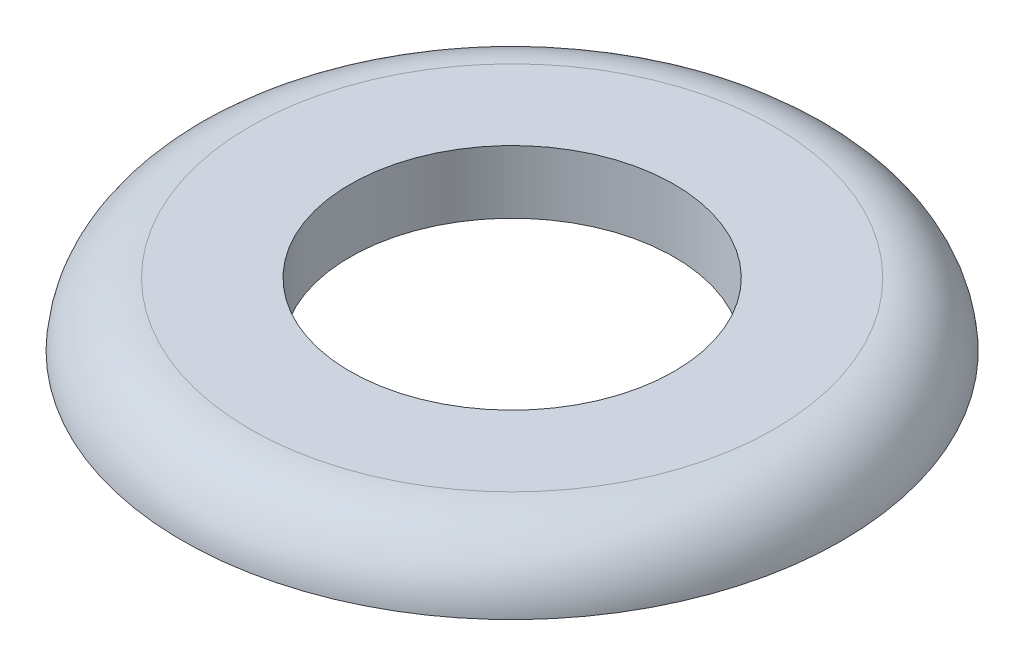
ISO-10303-21;
HEADER;
FILE_DESCRIPTION(('STEP AP214'),'2;1');
FILE_NAME('part.step','',(''),(''),'','','');
FILE_SCHEMA(('AUTOMOTIVE_DESIGN { 1 0 10303 214 1 1 1 1 }'));
ENDSEC;
DATA;
#1=APPLICATION_CONTEXT('core data for automotive mechanical design processes');
#2=APPLICATION_PROTOCOL_DEFINITION('international standard','automotive_design',2000,#1);
#3=PRODUCT_CONTEXT('',#1,'mechanical');
#4=PRODUCT('Part','Part','',(#3));
#5=PRODUCT_RELATED_PRODUCT_CATEGORY('part','',(#4));
#6=PRODUCT_DEFINITION_FORMATION('','',#4);
#7=PRODUCT_DEFINITION_CONTEXT('part definition',#1,'design');
#8=PRODUCT_DEFINITION('design','',#6,#7);
#9=PRODUCT_DEFINITION_SHAPE('','',#8);
#10=(LENGTH_UNIT() NAMED_UNIT(*) SI_UNIT(.MILLI.,.METRE.));
#11=(NAMED_UNIT(*) PLANE_ANGLE_UNIT() SI_UNIT($,.RADIAN.));
#12=(NAMED_UNIT(*) SI_UNIT($,.STERADIAN.) SOLID_ANGLE_UNIT());
#13=UNCERTAINTY_MEASURE_WITH_UNIT(LENGTH_MEASURE(1.E-05),#10,'distance_accuracy_value','');
#14=(GEOMETRIC_REPRESENTATION_CONTEXT(3) GLOBAL_UNCERTAINTY_ASSIGNED_CONTEXT((#13)) GLOBAL_UNIT_ASSIGNED_CONTEXT((#10,
#11,#12)) REPRESENTATION_CONTEXT('',''));
#15=CARTESIAN_POINT('',(0.,0.,0.));
#16=DIRECTION('',(0.,0.,1.));
#17=DIRECTION('',(1.,0.,0.));
#18=AXIS2_PLACEMENT_3D('',#15,#16,#17);
#19=CARTESIAN_POINT('',(1.55431223447522E-12,7.70889999999991,-2.61620000000229));
#20=DIRECTION('',(0.,1.,0.));
#21=DIRECTION('',(-1.,0.,0.));
#22=AXIS2_PLACEMENT_3D('',#19,#20,#21);
#23=PLANE('',#22);
#24=CARTESIAN_POINT('',(2.22250314474158E-13,7.70889999999992,-1.11033173121637E-12));
#25=DIRECTION('',(0.,-1.,0.));
#26=DIRECTION('',(0.,0.,-1.));
#27=AXIS2_PLACEMENT_3D('',#24,#25,#26);
#28=CIRCLE('',#27,4.23140486637039);
#29=CARTESIAN_POINT('',(2.20371193230495E-13,7.70889999999992,-4.2314048663715));
#30=VERTEX_POINT('',#29);
#31=EDGE_CURVE('E37',#30,#30,#28,.T.);
#32=ORIENTED_EDGE('',*,*,#31,.F.);
#33=EDGE_LOOP('',(#32));
#34=FACE_BOUND('',#33,.T.);
#35=CARTESIAN_POINT('',(0.,7.70889999999991,0.));
#36=DIRECTION('',(0.,-1.,0.));
#37=DIRECTION('',(1.,0.,0.));
#38=AXIS2_PLACEMENT_3D('',#35,#36,#37);
#39=CIRCLE('',#38,2.6162);
#40=CARTESIAN_POINT('',(2.6162,7.70889999999991,0.));
#41=VERTEX_POINT('',#40);
#42=EDGE_CURVE('E28',#41,#41,#39,.T.);
#43=ORIENTED_EDGE('',*,*,#42,.T.);
#44=EDGE_LOOP('',(#43));
#45=FACE_BOUND('',#44,.T.);
#46=ADVANCED_FACE('F15',(#34,#45),#23,.T.);
#47=CARTESIAN_POINT('',(2.22044604925031E-13,6.61669999999992,-1.11022302462516E-12));
#48=DIRECTION('',(0.,-1.,0.));
#49=DIRECTION('',(0.,0.,-1.));
#50=AXIS2_PLACEMENT_3D('',#47,#48,#49);
#51=TOROIDAL_SURFACE('',#50,4.23140486636972,1.0922);
#52=CARTESIAN_POINT('',(2.2205895675404E-13,6.6929,-1.11023060880594E-12));
#53=DIRECTION('',(0.,-1.,0.));
#54=DIRECTION('',(1.,0.,0.));
#55=AXIS2_PLACEMENT_3D('',#52,#53,#54);
#56=CIRCLE('',#55,5.3209434843177);
#57=CARTESIAN_POINT('',(5.32094348431792,6.6929,-1.11023060880594E-12));
#58=VERTEX_POINT('',#57);
#59=EDGE_CURVE('E23',#58,#58,#56,.T.);
#60=ORIENTED_EDGE('',*,*,#59,.F.);
#61=EDGE_LOOP('',(#60));
#62=FACE_BOUND('',#61,.T.);
#63=ORIENTED_EDGE('',*,*,#31,.T.);
#64=EDGE_LOOP('',(#63));
#65=FACE_BOUND('',#64,.T.);
#66=ADVANCED_FACE('F43',(#62,#65),#51,.T.);
#67=CARTESIAN_POINT('',(0.,0.,0.));
#68=DIRECTION('',(0.,-1.,0.));
#69=DIRECTION('',(1.,0.,0.));
#70=AXIS2_PLACEMENT_3D('',#67,#68,#69);
#71=CYLINDRICAL_SURFACE('',#70,2.6162);
#72=ORIENTED_EDGE('',*,*,#42,.F.);
#73=EDGE_LOOP('',(#72));
#74=FACE_BOUND('',#73,.T.);
#75=CARTESIAN_POINT('',(0.,6.6929,0.));
#76=DIRECTION('',(0.,-1.,0.));
#77=DIRECTION('',(1.,0.,0.));
#78=AXIS2_PLACEMENT_3D('',#75,#76,#77);
#79=CIRCLE('',#78,2.6162);
#80=CARTESIAN_POINT('',(2.6162,6.6929,0.));
#81=VERTEX_POINT('',#80);
#82=EDGE_CURVE('E10',#81,#81,#79,.F.);
#83=ORIENTED_EDGE('',*,*,#82,.F.);
#84=EDGE_LOOP('',(#83));
#85=FACE_BOUND('',#84,.T.);
#86=ADVANCED_FACE('F59',(#74,#85),#71,.F.);
#87=CARTESIAN_POINT('',(4.44089209850063E-13,6.6929,-5.32094348431911));
#88=DIRECTION('',(0.,-1.,0.));
#89=DIRECTION('',(1.,0.,0.));
#90=AXIS2_PLACEMENT_3D('',#87,#88,#89);
#91=PLANE('',#90);
#92=ORIENTED_EDGE('',*,*,#82,.T.);
#93=EDGE_LOOP('',(#92));
#94=FACE_BOUND('',#93,.T.);
#95=ORIENTED_EDGE('',*,*,#59,.T.);
#96=EDGE_LOOP('',(#95));
#97=FACE_BOUND('',#96,.T.);
#98=ADVANCED_FACE('F63',(#94,#97),#91,.T.);
#99=CLOSED_SHELL('',(#46,#66,#86,#98));
#100=MANIFOLD_SOLID_BREP('B1',#99);
#101=ADVANCED_BREP_SHAPE_REPRESENTATION('',(#18,#100),#14);
#102=SHAPE_DEFINITION_REPRESENTATION(#9,#101);
ENDSEC;
END-ISO-10303-21;
